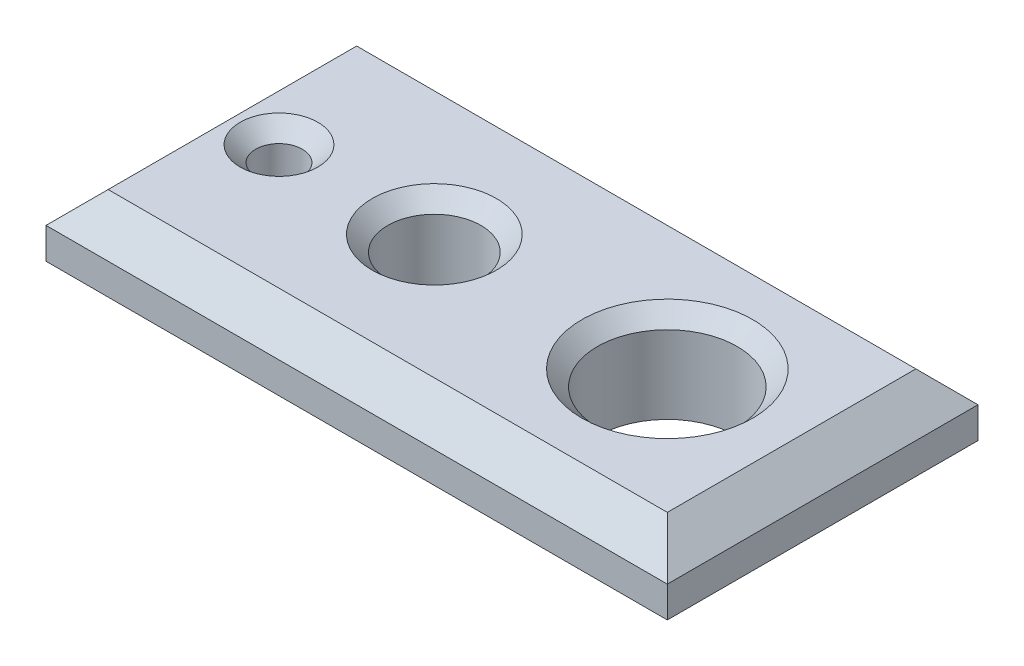
ISO-10303-21;
HEADER;
FILE_DESCRIPTION(('STEP AP214'),'2;1');
FILE_NAME('part.step','',(''),(''),'','','');
FILE_SCHEMA(('AUTOMOTIVE_DESIGN { 1 0 10303 214 1 1 1 1 }'));
ENDSEC;
DATA;
#1=APPLICATION_CONTEXT('core data for automotive mechanical design processes');
#2=APPLICATION_PROTOCOL_DEFINITION('international standard','automotive_design',2000,#1);
#3=PRODUCT_CONTEXT('',#1,'mechanical');
#4=PRODUCT('Part','Part','',(#3));
#5=PRODUCT_RELATED_PRODUCT_CATEGORY('part','',(#4));
#6=PRODUCT_DEFINITION_FORMATION('','',#4);
#7=PRODUCT_DEFINITION_CONTEXT('part definition',#1,'design');
#8=PRODUCT_DEFINITION('design','',#6,#7);
#9=PRODUCT_DEFINITION_SHAPE('','',#8);
#10=(LENGTH_UNIT() NAMED_UNIT(*) SI_UNIT(.MILLI.,.METRE.));
#11=(NAMED_UNIT(*) PLANE_ANGLE_UNIT() SI_UNIT($,.RADIAN.));
#12=(NAMED_UNIT(*) SI_UNIT($,.STERADIAN.) SOLID_ANGLE_UNIT());
#13=UNCERTAINTY_MEASURE_WITH_UNIT(LENGTH_MEASURE(1.E-05),#10,'distance_accuracy_value','');
#14=(GEOMETRIC_REPRESENTATION_CONTEXT(3) GLOBAL_UNCERTAINTY_ASSIGNED_CONTEXT((#13)) GLOBAL_UNIT_ASSIGNED_CONTEXT((#10,
#11,#12)) REPRESENTATION_CONTEXT('',''));
#15=CARTESIAN_POINT('',(0.,0.,0.));
#16=DIRECTION('',(0.,0.,1.));
#17=DIRECTION('',(1.,0.,0.));
#18=AXIS2_PLACEMENT_3D('',#15,#16,#17);
#19=CARTESIAN_POINT('',(100.,30.,-50.));
#20=DIRECTION('',(-1.,0.,0.));
#21=DIRECTION('',(0.,0.,1.));
#22=AXIS2_PLACEMENT_3D('',#19,#20,#21);
#23=PLANE('',#22);
#24=DIRECTION('',(0.,-1.,0.));
#25=VECTOR('',#24,1.);
#26=CARTESIAN_POINT('',(100.,30.,50.));
#27=LINE('',#26,#25);
#28=CARTESIAN_POINT('',(100.,19.9999999999999,50.));
#29=VERTEX_POINT('',#28);
#30=CARTESIAN_POINT('',(100.,10.,50.));
#31=VERTEX_POINT('',#30);
#32=EDGE_CURVE('E128',#29,#31,#27,.T.);
#33=ORIENTED_EDGE('',*,*,#32,.T.);
#34=DIRECTION('',(0.,0.,-1.));
#35=VECTOR('',#34,1.);
#36=CARTESIAN_POINT('',(100.,10.,-50.));
#37=LINE('',#36,#35);
#38=CARTESIAN_POINT('',(100.,10.,-50.));
#39=VERTEX_POINT('',#38);
#40=EDGE_CURVE('E130',#31,#39,#37,.T.);
#41=ORIENTED_EDGE('',*,*,#40,.T.);
#42=DIRECTION('',(0.,-1.,0.));
#43=VECTOR('',#42,1.);
#44=CARTESIAN_POINT('',(100.,30.,-50.));
#45=LINE('',#44,#43);
#46=CARTESIAN_POINT('',(100.,19.9999999999999,-50.));
#47=VERTEX_POINT('',#46);
#48=EDGE_CURVE('E123',#47,#39,#45,.T.);
#49=ORIENTED_EDGE('',*,*,#48,.F.);
#50=DIRECTION('',(0.,0.,1.));
#51=VECTOR('',#50,1.);
#52=CARTESIAN_POINT('',(100.,19.9999999999999,50.));
#53=LINE('',#52,#51);
#54=EDGE_CURVE('E107',#47,#29,#53,.T.);
#55=ORIENTED_EDGE('',*,*,#54,.T.);
#56=EDGE_LOOP('',(#33,#41,#49,#55));
#57=FACE_BOUND('',#56,.T.);
#58=ADVANCED_FACE('F37',(#57),#23,.F.);
#59=CARTESIAN_POINT('',(-100.,30.,-50.));
#60=DIRECTION('',(0.,0.,1.));
#61=DIRECTION('',(1.,0.,0.));
#62=AXIS2_PLACEMENT_3D('',#59,#60,#61);
#63=PLANE('',#62);
#64=ORIENTED_EDGE('',*,*,#48,.T.);
#65=DIRECTION('',(-1.,0.,0.));
#66=VECTOR('',#65,1.);
#67=CARTESIAN_POINT('',(-100.,10.,-50.));
#68=LINE('',#67,#66);
#69=CARTESIAN_POINT('',(-100.,10.,-50.));
#70=VERTEX_POINT('',#69);
#71=EDGE_CURVE('E131',#39,#70,#68,.T.);
#72=ORIENTED_EDGE('',*,*,#71,.T.);
#73=DIRECTION('',(0.,-1.,0.));
#74=VECTOR('',#73,1.);
#75=CARTESIAN_POINT('',(-100.,30.,-50.));
#76=LINE('',#75,#74);
#77=CARTESIAN_POINT('',(-100.,19.9999999999999,-50.));
#78=VERTEX_POINT('',#77);
#79=EDGE_CURVE('E139',#78,#70,#76,.T.);
#80=ORIENTED_EDGE('',*,*,#79,.F.);
#81=DIRECTION('',(1.,0.,0.));
#82=VECTOR('',#81,1.);
#83=CARTESIAN_POINT('',(100.,19.9999999999999,-50.));
#84=LINE('',#83,#82);
#85=EDGE_CURVE('E165',#78,#47,#84,.T.);
#86=ORIENTED_EDGE('',*,*,#85,.T.);
#87=EDGE_LOOP('',(#64,#72,#80,#86));
#88=FACE_BOUND('',#87,.T.);
#89=ADVANCED_FACE('F218',(#88),#63,.F.);
#90=CARTESIAN_POINT('',(-100.,30.,-50.));
#91=DIRECTION('',(1.,0.,0.));
#92=DIRECTION('',(0.,0.,-1.));
#93=AXIS2_PLACEMENT_3D('',#90,#91,#92);
#94=PLANE('',#93);
#95=ORIENTED_EDGE('',*,*,#79,.T.);
#96=DIRECTION('',(0.,0.,1.));
#97=VECTOR('',#96,1.);
#98=CARTESIAN_POINT('',(-100.,10.,-50.));
#99=LINE('',#98,#97);
#100=CARTESIAN_POINT('',(-100.,10.,50.));
#101=VERTEX_POINT('',#100);
#102=EDGE_CURVE('E163',#70,#101,#99,.T.);
#103=ORIENTED_EDGE('',*,*,#102,.T.);
#104=DIRECTION('',(0.,-1.,0.));
#105=VECTOR('',#104,1.);
#106=CARTESIAN_POINT('',(-100.,30.,50.));
#107=LINE('',#106,#105);
#108=CARTESIAN_POINT('',(-100.,19.9999999999999,50.));
#109=VERTEX_POINT('',#108);
#110=EDGE_CURVE('E136',#109,#101,#107,.T.);
#111=ORIENTED_EDGE('',*,*,#110,.F.);
#112=DIRECTION('',(0.,0.,-1.));
#113=VECTOR('',#112,1.);
#114=CARTESIAN_POINT('',(-100.,19.9999999999999,-50.));
#115=LINE('',#114,#113);
#116=EDGE_CURVE('E161',#109,#78,#115,.T.);
#117=ORIENTED_EDGE('',*,*,#116,.T.);
#118=EDGE_LOOP('',(#95,#103,#111,#117));
#119=FACE_BOUND('',#118,.T.);
#120=ADVANCED_FACE('F223',(#119),#94,.F.);
#121=CARTESIAN_POINT('',(-100.,30.,50.));
#122=DIRECTION('',(0.,0.,-1.));
#123=DIRECTION('',(-1.,0.,0.));
#124=AXIS2_PLACEMENT_3D('',#121,#122,#123);
#125=PLANE('',#124);
#126=ORIENTED_EDGE('',*,*,#110,.T.);
#127=DIRECTION('',(1.,0.,0.));
#128=VECTOR('',#127,1.);
#129=CARTESIAN_POINT('',(-100.,10.,50.));
#130=LINE('',#129,#128);
#131=EDGE_CURVE('E122',#101,#31,#130,.T.);
#132=ORIENTED_EDGE('',*,*,#131,.T.);
#133=ORIENTED_EDGE('',*,*,#32,.F.);
#134=DIRECTION('',(-1.,0.,0.));
#135=VECTOR('',#134,1.);
#136=CARTESIAN_POINT('',(-100.,19.9999999999999,50.));
#137=LINE('',#136,#135);
#138=EDGE_CURVE('E114',#29,#109,#137,.T.);
#139=ORIENTED_EDGE('',*,*,#138,.T.);
#140=EDGE_LOOP('',(#126,#132,#133,#139));
#141=FACE_BOUND('',#140,.T.);
#142=ADVANCED_FACE('F134',(#141),#125,.F.);
#143=CARTESIAN_POINT('',(0.,30.,0.));
#144=DIRECTION('',(0.,1.,0.));
#145=DIRECTION('',(0.,0.,1.));
#146=AXIS2_PLACEMENT_3D('',#143,#144,#145);
#147=PLANE('',#146);
#148=CARTESIAN_POINT('',(-75.,30.,0.));
#149=DIRECTION('',(0.,1.,0.));
#150=DIRECTION('',(0.,0.,1.));
#151=AXIS2_PLACEMENT_3D('',#148,#149,#150);
#152=CIRCLE('',#151,12.5);
#153=CARTESIAN_POINT('',(-75.,30.,12.5));
#154=VERTEX_POINT('',#153);
#155=EDGE_CURVE('E195',#154,#154,#152,.F.);
#156=ORIENTED_EDGE('',*,*,#155,.T.);
#157=EDGE_LOOP('',(#156));
#158=FACE_BOUND('',#157,.T.);
#159=CARTESIAN_POINT('',(-25.,30.,0.));
#160=DIRECTION('',(0.,1.,0.));
#161=DIRECTION('',(0.,0.,1.));
#162=AXIS2_PLACEMENT_3D('',#159,#160,#161);
#163=CIRCLE('',#162,20.);
#164=CARTESIAN_POINT('',(-25.,30.,20.));
#165=VERTEX_POINT('',#164);
#166=EDGE_CURVE('E192',#165,#165,#163,.F.);
#167=ORIENTED_EDGE('',*,*,#166,.T.);
#168=EDGE_LOOP('',(#167));
#169=FACE_BOUND('',#168,.T.);
#170=CARTESIAN_POINT('',(50.,30.,0.));
#171=DIRECTION('',(0.,1.,0.));
#172=DIRECTION('',(0.,0.,1.));
#173=AXIS2_PLACEMENT_3D('',#170,#171,#172);
#174=CIRCLE('',#173,27.5);
#175=CARTESIAN_POINT('',(50.,30.,27.5));
#176=VERTEX_POINT('',#175);
#177=EDGE_CURVE('E189',#176,#176,#174,.F.);
#178=ORIENTED_EDGE('',*,*,#177,.T.);
#179=EDGE_LOOP('',(#178));
#180=FACE_BOUND('',#179,.T.);
#181=DIRECTION('',(1.,0.,0.));
#182=VECTOR('',#181,1.);
#183=CARTESIAN_POINT('',(100.,30.,40.));
#184=LINE('',#183,#182);
#185=CARTESIAN_POINT('',(-90.,30.,40.));
#186=VERTEX_POINT('',#185);
#187=CARTESIAN_POINT('',(90.,30.,40.));
#188=VERTEX_POINT('',#187);
#189=EDGE_CURVE('E169',#186,#188,#184,.T.);
#190=ORIENTED_EDGE('',*,*,#189,.T.);
#191=DIRECTION('',(0.,0.,-1.));
#192=VECTOR('',#191,1.);
#193=CARTESIAN_POINT('',(90.,30.,-50.));
#194=LINE('',#193,#192);
#195=CARTESIAN_POINT('',(90.,30.,-40.));
#196=VERTEX_POINT('',#195);
#197=EDGE_CURVE('E108',#188,#196,#194,.T.);
#198=ORIENTED_EDGE('',*,*,#197,.T.);
#199=DIRECTION('',(-1.,0.,0.));
#200=VECTOR('',#199,1.);
#201=CARTESIAN_POINT('',(-100.,30.,-40.));
#202=LINE('',#201,#200);
#203=CARTESIAN_POINT('',(-90.,30.,-40.));
#204=VERTEX_POINT('',#203);
#205=EDGE_CURVE('E60',#196,#204,#202,.T.);
#206=ORIENTED_EDGE('',*,*,#205,.T.);
#207=DIRECTION('',(0.,0.,1.));
#208=VECTOR('',#207,1.);
#209=CARTESIAN_POINT('',(-90.,30.,50.));
#210=LINE('',#209,#208);
#211=EDGE_CURVE('E171',#204,#186,#210,.T.);
#212=ORIENTED_EDGE('',*,*,#211,.T.);
#213=EDGE_LOOP('',(#190,#198,#206,#212));
#214=FACE_BOUND('',#213,.T.);
#215=ADVANCED_FACE('F308',(#158,#169,#180,#214),#147,.T.);
#216=CARTESIAN_POINT('',(0.,0.,0.));
#217=DIRECTION('',(0.,1.,0.));
#218=DIRECTION('',(0.,0.,1.));
#219=AXIS2_PLACEMENT_3D('',#216,#217,#218);
#220=PLANE('',#219);
#221=CARTESIAN_POINT('',(-75.,0.,0.));
#222=DIRECTION('',(0.,1.,0.));
#223=DIRECTION('',(0.,0.,1.));
#224=AXIS2_PLACEMENT_3D('',#221,#222,#223);
#225=CIRCLE('',#224,7.50000000000001);
#226=CARTESIAN_POINT('',(-75.,0.,7.50000000000001));
#227=VERTEX_POINT('',#226);
#228=EDGE_CURVE('E182',#227,#227,#225,.T.);
#229=ORIENTED_EDGE('',*,*,#228,.T.);
#230=EDGE_LOOP('',(#229));
#231=FACE_BOUND('',#230,.T.);
#232=CARTESIAN_POINT('',(-25.,0.,0.));
#233=DIRECTION('',(0.,1.,0.));
#234=DIRECTION('',(0.,0.,1.));
#235=AXIS2_PLACEMENT_3D('',#232,#233,#234);
#236=CIRCLE('',#235,15.);
#237=CARTESIAN_POINT('',(-25.,0.,15.));
#238=VERTEX_POINT('',#237);
#239=EDGE_CURVE('E387',#238,#238,#236,.T.);
#240=ORIENTED_EDGE('',*,*,#239,.T.);
#241=EDGE_LOOP('',(#240));
#242=FACE_BOUND('',#241,.T.);
#243=CARTESIAN_POINT('',(50.,0.,0.));
#244=DIRECTION('',(0.,1.,0.));
#245=DIRECTION('',(0.,0.,1.));
#246=AXIS2_PLACEMENT_3D('',#243,#244,#245);
#247=CIRCLE('',#246,22.5);
#248=CARTESIAN_POINT('',(50.,0.,22.5));
#249=VERTEX_POINT('',#248);
#250=EDGE_CURVE('E145',#249,#249,#247,.T.);
#251=ORIENTED_EDGE('',*,*,#250,.T.);
#252=EDGE_LOOP('',(#251));
#253=FACE_BOUND('',#252,.T.);
#254=DIRECTION('',(0.,0.,1.));
#255=VECTOR('',#254,1.);
#256=CARTESIAN_POINT('',(90.,0.,0.));
#257=LINE('',#256,#255);
#258=CARTESIAN_POINT('',(90.,0.,-40.));
#259=VERTEX_POINT('',#258);
#260=CARTESIAN_POINT('',(90.,0.,40.));
#261=VERTEX_POINT('',#260);
#262=EDGE_CURVE('E152',#259,#261,#257,.T.);
#263=ORIENTED_EDGE('',*,*,#262,.T.);
#264=DIRECTION('',(-1.,0.,0.));
#265=VECTOR('',#264,1.);
#266=CARTESIAN_POINT('',(0.,0.,40.));
#267=LINE('',#266,#265);
#268=CARTESIAN_POINT('',(-90.,0.,40.));
#269=VERTEX_POINT('',#268);
#270=EDGE_CURVE('E158',#261,#269,#267,.T.);
#271=ORIENTED_EDGE('',*,*,#270,.T.);
#272=DIRECTION('',(0.,0.,-1.));
#273=VECTOR('',#272,1.);
#274=CARTESIAN_POINT('',(-90.,0.,0.));
#275=LINE('',#274,#273);
#276=CARTESIAN_POINT('',(-90.,0.,-40.));
#277=VERTEX_POINT('',#276);
#278=EDGE_CURVE('E156',#269,#277,#275,.T.);
#279=ORIENTED_EDGE('',*,*,#278,.T.);
#280=DIRECTION('',(1.,0.,0.));
#281=VECTOR('',#280,1.);
#282=CARTESIAN_POINT('',(0.,0.,-40.));
#283=LINE('',#282,#281);
#284=EDGE_CURVE('E154',#277,#259,#283,.T.);
#285=ORIENTED_EDGE('',*,*,#284,.T.);
#286=EDGE_LOOP('',(#263,#271,#279,#285));
#287=FACE_BOUND('',#286,.T.);
#288=ADVANCED_FACE('F257',(#231,#242,#253,#287),#220,.F.);
#289=CARTESIAN_POINT('',(-100.,10.,-50.));
#290=DIRECTION('',(0.,0.707106781186549,0.707106781186547));
#291=DIRECTION('',(-1.,0.,0.));
#292=AXIS2_PLACEMENT_3D('',#289,#290,#291);
#293=PLANE('',#292);
#294=DIRECTION('',(0.577350269189626,0.577350269189625,-0.577350269189626));
#295=VECTOR('',#294,1.);
#296=CARTESIAN_POINT('',(100.,10.,-50.));
#297=LINE('',#296,#295);
#298=EDGE_CURVE('E142',#259,#39,#297,.T.);
#299=ORIENTED_EDGE('',*,*,#298,.F.);
#300=ORIENTED_EDGE('',*,*,#284,.F.);
#301=DIRECTION('',(-0.577350269189626,0.577350269189625,-0.577350269189626));
#302=VECTOR('',#301,1.);
#303=CARTESIAN_POINT('',(-100.,10.,-50.));
#304=LINE('',#303,#302);
#305=EDGE_CURVE('E137',#70,#277,#304,.F.);
#306=ORIENTED_EDGE('',*,*,#305,.F.);
#307=ORIENTED_EDGE('',*,*,#71,.F.);
#308=EDGE_LOOP('',(#299,#300,#306,#307));
#309=FACE_BOUND('',#308,.T.);
#310=ADVANCED_FACE('F251',(#309),#293,.F.);
#311=CARTESIAN_POINT('',(-100.,10.,-50.));
#312=DIRECTION('',(0.707106781186547,0.707106781186549,0.));
#313=DIRECTION('',(0.,0.,1.));
#314=AXIS2_PLACEMENT_3D('',#311,#312,#313);
#315=PLANE('',#314);
#316=ORIENTED_EDGE('',*,*,#305,.T.);
#317=ORIENTED_EDGE('',*,*,#278,.F.);
#318=DIRECTION('',(-0.577350269189626,0.577350269189625,0.577350269189626));
#319=VECTOR('',#318,1.);
#320=CARTESIAN_POINT('',(-66.6666666666666,-23.3333333333333,16.6666666666666));
#321=LINE('',#320,#319);
#322=EDGE_CURVE('E178',#101,#269,#321,.F.);
#323=ORIENTED_EDGE('',*,*,#322,.F.);
#324=ORIENTED_EDGE('',*,*,#102,.F.);
#325=EDGE_LOOP('',(#316,#317,#323,#324));
#326=FACE_BOUND('',#325,.T.);
#327=ADVANCED_FACE('F244',(#326),#315,.F.);
#328=CARTESIAN_POINT('',(100.,10.,-50.));
#329=DIRECTION('',(-0.707106781186547,0.707106781186549,0.));
#330=DIRECTION('',(0.,0.,-1.));
#331=AXIS2_PLACEMENT_3D('',#328,#329,#330);
#332=PLANE('',#331);
#333=ORIENTED_EDGE('',*,*,#298,.T.);
#334=ORIENTED_EDGE('',*,*,#40,.F.);
#335=DIRECTION('',(-0.577350269189626,-0.577350269189625,-0.577350269189626));
#336=VECTOR('',#335,1.);
#337=CARTESIAN_POINT('',(66.6666666666666,-23.3333333333333,16.6666666666666));
#338=LINE('',#337,#336);
#339=EDGE_CURVE('E176',#261,#31,#338,.F.);
#340=ORIENTED_EDGE('',*,*,#339,.F.);
#341=ORIENTED_EDGE('',*,*,#262,.F.);
#342=EDGE_LOOP('',(#333,#334,#340,#341));
#343=FACE_BOUND('',#342,.T.);
#344=ADVANCED_FACE('F237',(#343),#332,.F.);
#345=CARTESIAN_POINT('',(-100.,10.,50.));
#346=DIRECTION('',(0.,0.707106781186549,-0.707106781186547));
#347=DIRECTION('',(1.,0.,0.));
#348=AXIS2_PLACEMENT_3D('',#345,#346,#347);
#349=PLANE('',#348);
#350=ORIENTED_EDGE('',*,*,#322,.T.);
#351=ORIENTED_EDGE('',*,*,#270,.F.);
#352=ORIENTED_EDGE('',*,*,#339,.T.);
#353=ORIENTED_EDGE('',*,*,#131,.F.);
#354=EDGE_LOOP('',(#350,#351,#352,#353));
#355=FACE_BOUND('',#354,.T.);
#356=ADVANCED_FACE('F229',(#355),#349,.F.);
#357=CARTESIAN_POINT('',(-90.,30.,0.));
#358=DIRECTION('',(-0.707106781186548,0.707106781186546,0.));
#359=DIRECTION('',(0.,0.,-1.));
#360=AXIS2_PLACEMENT_3D('',#357,#358,#359);
#361=PLANE('',#360);
#362=DIRECTION('',(-0.577350269189625,-0.577350269189627,-0.577350269189625));
#363=VECTOR('',#362,1.);
#364=CARTESIAN_POINT('',(-76.6666666666667,43.3333333333333,-26.6666666666667));
#365=LINE('',#364,#363);
#366=EDGE_CURVE('E111',#78,#204,#365,.F.);
#367=ORIENTED_EDGE('',*,*,#366,.F.);
#368=ORIENTED_EDGE('',*,*,#116,.F.);
#369=DIRECTION('',(-0.577350269189625,-0.577350269189627,0.577350269189625));
#370=VECTOR('',#369,1.);
#371=CARTESIAN_POINT('',(-60.,60.,10.));
#372=LINE('',#371,#370);
#373=EDGE_CURVE('E117',#186,#109,#372,.T.);
#374=ORIENTED_EDGE('',*,*,#373,.F.);
#375=ORIENTED_EDGE('',*,*,#211,.F.);
#376=EDGE_LOOP('',(#367,#368,#374,#375));
#377=FACE_BOUND('',#376,.T.);
#378=ADVANCED_FACE('F236',(#377),#361,.T.);
#379=CARTESIAN_POINT('',(0.,30.,40.));
#380=DIRECTION('',(0.,0.707106781186546,0.707106781186548));
#381=DIRECTION('',(-1.,0.,0.));
#382=AXIS2_PLACEMENT_3D('',#379,#380,#381);
#383=PLANE('',#382);
#384=ORIENTED_EDGE('',*,*,#373,.T.);
#385=ORIENTED_EDGE('',*,*,#138,.F.);
#386=DIRECTION('',(-0.577350269189625,0.577350269189627,-0.577350269189625));
#387=VECTOR('',#386,1.);
#388=CARTESIAN_POINT('',(60.,60.,10.));
#389=LINE('',#388,#387);
#390=EDGE_CURVE('E103',#188,#29,#389,.F.);
#391=ORIENTED_EDGE('',*,*,#390,.F.);
#392=ORIENTED_EDGE('',*,*,#189,.F.);
#393=EDGE_LOOP('',(#384,#385,#391,#392));
#394=FACE_BOUND('',#393,.T.);
#395=ADVANCED_FACE('F115',(#394),#383,.T.);
#396=CARTESIAN_POINT('',(0.,30.,-40.));
#397=DIRECTION('',(0.,0.707106781186546,-0.707106781186548));
#398=DIRECTION('',(1.,0.,0.));
#399=AXIS2_PLACEMENT_3D('',#396,#397,#398);
#400=PLANE('',#399);
#401=ORIENTED_EDGE('',*,*,#366,.T.);
#402=ORIENTED_EDGE('',*,*,#205,.F.);
#403=DIRECTION('',(0.577350269189625,-0.577350269189627,-0.577350269189625));
#404=VECTOR('',#403,1.);
#405=CARTESIAN_POINT('',(60.,60.,-10.));
#406=LINE('',#405,#404);
#407=EDGE_CURVE('E53',#47,#196,#406,.F.);
#408=ORIENTED_EDGE('',*,*,#407,.F.);
#409=ORIENTED_EDGE('',*,*,#85,.F.);
#410=EDGE_LOOP('',(#401,#402,#408,#409));
#411=FACE_BOUND('',#410,.T.);
#412=ADVANCED_FACE('F267',(#411),#400,.T.);
#413=CARTESIAN_POINT('',(90.,30.,0.));
#414=DIRECTION('',(0.707106781186548,0.707106781186546,0.));
#415=DIRECTION('',(0.,0.,1.));
#416=AXIS2_PLACEMENT_3D('',#413,#414,#415);
#417=PLANE('',#416);
#418=ORIENTED_EDGE('',*,*,#390,.T.);
#419=ORIENTED_EDGE('',*,*,#54,.F.);
#420=ORIENTED_EDGE('',*,*,#407,.T.);
#421=ORIENTED_EDGE('',*,*,#197,.F.);
#422=EDGE_LOOP('',(#418,#419,#420,#421));
#423=FACE_BOUND('',#422,.T.);
#424=ADVANCED_FACE('F105',(#423),#417,.T.);
#425=CARTESIAN_POINT('',(50.,0.,0.));
#426=DIRECTION('',(0.,1.,0.));
#427=DIRECTION('',(0.,0.,1.));
#428=AXIS2_PLACEMENT_3D('',#425,#426,#427);
#429=CYLINDRICAL_SURFACE('',#428,22.5);
#430=CARTESIAN_POINT('',(50.,25.,0.));
#431=DIRECTION('',(0.,1.,0.));
#432=DIRECTION('',(0.,0.,1.));
#433=AXIS2_PLACEMENT_3D('',#430,#431,#432);
#434=CIRCLE('',#433,22.5);
#435=CARTESIAN_POINT('',(50.,25.,22.5));
#436=VERTEX_POINT('',#435);
#437=EDGE_CURVE('E11',#436,#436,#434,.T.);
#438=ORIENTED_EDGE('',*,*,#437,.T.);
#439=EDGE_LOOP('',(#438));
#440=FACE_BOUND('',#439,.T.);
#441=ORIENTED_EDGE('',*,*,#250,.F.);
#442=EDGE_LOOP('',(#441));
#443=FACE_BOUND('',#442,.T.);
#444=ADVANCED_FACE('F266',(#440,#443),#429,.F.);
#445=CARTESIAN_POINT('',(-25.,0.,0.));
#446=DIRECTION('',(0.,1.,0.));
#447=DIRECTION('',(0.,0.,1.));
#448=AXIS2_PLACEMENT_3D('',#445,#446,#447);
#449=CYLINDRICAL_SURFACE('',#448,15.);
#450=CARTESIAN_POINT('',(-25.,25.,0.));
#451=DIRECTION('',(0.,1.,0.));
#452=DIRECTION('',(0.,0.,1.));
#453=AXIS2_PLACEMENT_3D('',#450,#451,#452);
#454=CIRCLE('',#453,15.);
#455=CARTESIAN_POINT('',(-25.,25.,15.));
#456=VERTEX_POINT('',#455);
#457=EDGE_CURVE('E46',#456,#456,#454,.T.);
#458=ORIENTED_EDGE('',*,*,#457,.T.);
#459=EDGE_LOOP('',(#458));
#460=FACE_BOUND('',#459,.T.);
#461=ORIENTED_EDGE('',*,*,#239,.F.);
#462=EDGE_LOOP('',(#461));
#463=FACE_BOUND('',#462,.T.);
#464=ADVANCED_FACE('F200',(#460,#463),#449,.F.);
#465=CARTESIAN_POINT('',(-75.,0.,0.));
#466=DIRECTION('',(0.,1.,0.));
#467=DIRECTION('',(0.,0.,1.));
#468=AXIS2_PLACEMENT_3D('',#465,#466,#467);
#469=CYLINDRICAL_SURFACE('',#468,7.50000000000001);
#470=CARTESIAN_POINT('',(-75.,25.,0.));
#471=DIRECTION('',(0.,1.,0.));
#472=DIRECTION('',(0.,0.,1.));
#473=AXIS2_PLACEMENT_3D('',#470,#471,#472);
#474=CIRCLE('',#473,7.50000000000001);
#475=CARTESIAN_POINT('',(-75.,25.,7.50000000000001));
#476=VERTEX_POINT('',#475);
#477=EDGE_CURVE('E175',#476,#476,#474,.T.);
#478=ORIENTED_EDGE('',*,*,#477,.T.);
#479=EDGE_LOOP('',(#478));
#480=FACE_BOUND('',#479,.T.);
#481=ORIENTED_EDGE('',*,*,#228,.F.);
#482=EDGE_LOOP('',(#481));
#483=FACE_BOUND('',#482,.T.);
#484=ADVANCED_FACE('F212',(#480,#483),#469,.F.);
#485=CARTESIAN_POINT('',(-75.,25.,0.));
#486=DIRECTION('',(0.,1.,0.));
#487=DIRECTION('',(0.,0.,1.));
#488=AXIS2_PLACEMENT_3D('',#485,#486,#487);
#489=CONICAL_SURFACE('',#488,7.50000000000001,0.785398163397449);
#490=ORIENTED_EDGE('',*,*,#155,.F.);
#491=EDGE_LOOP('',(#490));
#492=FACE_BOUND('',#491,.T.);
#493=ORIENTED_EDGE('',*,*,#477,.F.);
#494=EDGE_LOOP('',(#493));
#495=FACE_BOUND('',#494,.T.);
#496=ADVANCED_FACE('F205',(#492,#495),#489,.F.);
#497=CARTESIAN_POINT('',(-25.,25.,0.));
#498=DIRECTION('',(0.,1.,0.));
#499=DIRECTION('',(0.,0.,1.));
#500=AXIS2_PLACEMENT_3D('',#497,#498,#499);
#501=CONICAL_SURFACE('',#500,15.,0.785398163397448);
#502=ORIENTED_EDGE('',*,*,#166,.F.);
#503=EDGE_LOOP('',(#502));
#504=FACE_BOUND('',#503,.T.);
#505=ORIENTED_EDGE('',*,*,#457,.F.);
#506=EDGE_LOOP('',(#505));
#507=FACE_BOUND('',#506,.T.);
#508=ADVANCED_FACE('F203',(#504,#507),#501,.F.);
#509=CARTESIAN_POINT('',(50.,25.,0.));
#510=DIRECTION('',(0.,1.,0.));
#511=DIRECTION('',(0.,0.,1.));
#512=AXIS2_PLACEMENT_3D('',#509,#510,#511);
#513=CONICAL_SURFACE('',#512,22.5,0.785398163397448);
#514=ORIENTED_EDGE('',*,*,#177,.F.);
#515=EDGE_LOOP('',(#514));
#516=FACE_BOUND('',#515,.T.);
#517=ORIENTED_EDGE('',*,*,#437,.F.);
#518=EDGE_LOOP('',(#517));
#519=FACE_BOUND('',#518,.T.);
#520=ADVANCED_FACE('F40',(#516,#519),#513,.F.);
#521=CLOSED_SHELL('',(#58,#89,#120,#142,#215,#288,#310,#327,#344,#356,#378,#395,#412,#424,#444,
#464,#484,#496,#508,#520));
#522=MANIFOLD_SOLID_BREP('B2',#521);
#523=ADVANCED_BREP_SHAPE_REPRESENTATION('',(#18,#522),#14);
#524=SHAPE_DEFINITION_REPRESENTATION(#9,#523);
ENDSEC;
END-ISO-10303-21;
